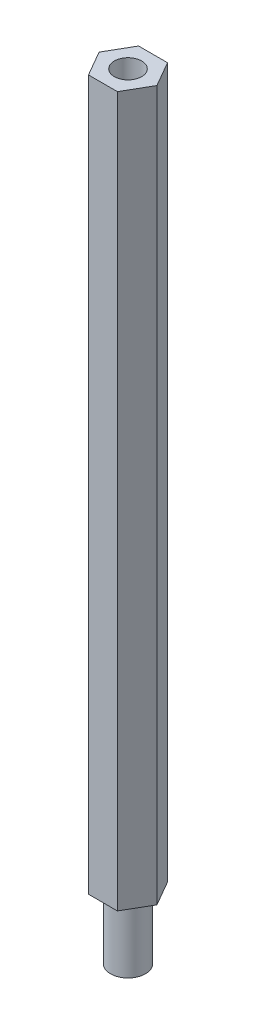
ISO-10303-21;
HEADER;
FILE_DESCRIPTION(('STEP AP214'),'2;1');
FILE_NAME('part.step','',(''),(''),'','','');
FILE_SCHEMA(('AUTOMOTIVE_DESIGN { 1 0 10303 214 1 1 1 1 }'));
ENDSEC;
DATA;
#1=APPLICATION_CONTEXT('core data for automotive mechanical design processes');
#2=APPLICATION_PROTOCOL_DEFINITION('international standard','automotive_design',2000,#1);
#3=PRODUCT_CONTEXT('',#1,'mechanical');
#4=PRODUCT('Part','Part','',(#3));
#5=PRODUCT_RELATED_PRODUCT_CATEGORY('part','',(#4));
#6=PRODUCT_DEFINITION_FORMATION('','',#4);
#7=PRODUCT_DEFINITION_CONTEXT('part definition',#1,'design');
#8=PRODUCT_DEFINITION('design','',#6,#7);
#9=PRODUCT_DEFINITION_SHAPE('','',#8);
#10=(LENGTH_UNIT() NAMED_UNIT(*) SI_UNIT(.MILLI.,.METRE.));
#11=(NAMED_UNIT(*) PLANE_ANGLE_UNIT() SI_UNIT($,.RADIAN.));
#12=(NAMED_UNIT(*) SI_UNIT($,.STERADIAN.) SOLID_ANGLE_UNIT());
#13=UNCERTAINTY_MEASURE_WITH_UNIT(LENGTH_MEASURE(1.E-05),#10,'distance_accuracy_value','');
#14=(GEOMETRIC_REPRESENTATION_CONTEXT(3) GLOBAL_UNCERTAINTY_ASSIGNED_CONTEXT((#13)) GLOBAL_UNIT_ASSIGNED_CONTEXT((#10,
#11,#12)) REPRESENTATION_CONTEXT('',''));
#15=CARTESIAN_POINT('',(0.,0.,0.));
#16=DIRECTION('',(0.,0.,1.));
#17=DIRECTION('',(1.,0.,0.));
#18=AXIS2_PLACEMENT_3D('',#15,#16,#17);
#19=CARTESIAN_POINT('',(-1.325,65.,2.29496732002876));
#20=DIRECTION('',(0.,0.,-1.));
#21=DIRECTION('',(-1.,0.,0.));
#22=AXIS2_PLACEMENT_3D('',#19,#20,#21);
#23=PLANE('',#22);
#24=DIRECTION('',(1.,0.,0.));
#25=VECTOR('',#24,1.);
#26=CARTESIAN_POINT('',(-1.325,0.,2.29496732002876));
#27=LINE('',#26,#25);
#28=CARTESIAN_POINT('',(-1.325,0.,2.29496732002876));
#29=VERTEX_POINT('',#28);
#30=CARTESIAN_POINT('',(1.325,0.,2.29496732002876));
#31=VERTEX_POINT('',#30);
#32=EDGE_CURVE('E121',#29,#31,#27,.T.);
#33=ORIENTED_EDGE('',*,*,#32,.T.);
#34=DIRECTION('',(0.,-1.,0.));
#35=VECTOR('',#34,1.);
#36=CARTESIAN_POINT('',(1.325,65.,2.29496732002876));
#37=LINE('',#36,#35);
#38=CARTESIAN_POINT('',(1.325,65.,2.29496732002876));
#39=VERTEX_POINT('',#38);
#40=EDGE_CURVE('E44',#39,#31,#37,.T.);
#41=ORIENTED_EDGE('',*,*,#40,.F.);
#42=DIRECTION('',(1.,0.,0.));
#43=VECTOR('',#42,1.);
#44=CARTESIAN_POINT('',(-1.325,65.,2.29496732002876));
#45=LINE('',#44,#43);
#46=CARTESIAN_POINT('',(-1.325,65.,2.29496732002876));
#47=VERTEX_POINT('',#46);
#48=EDGE_CURVE('E132',#47,#39,#45,.T.);
#49=ORIENTED_EDGE('',*,*,#48,.F.);
#50=DIRECTION('',(0.,-1.,0.));
#51=VECTOR('',#50,1.);
#52=CARTESIAN_POINT('',(-1.325,65.,2.29496732002876));
#53=LINE('',#52,#51);
#54=EDGE_CURVE('E117',#47,#29,#53,.T.);
#55=ORIENTED_EDGE('',*,*,#54,.T.);
#56=EDGE_LOOP('',(#33,#41,#49,#55));
#57=FACE_BOUND('',#56,.T.);
#58=ADVANCED_FACE('F36',(#57),#23,.F.);
#59=CARTESIAN_POINT('',(1.325,65.,2.29496732002876));
#60=DIRECTION('',(-0.866025403784439,0.,-0.5));
#61=DIRECTION('',(-0.5,0.,0.866025403784439));
#62=AXIS2_PLACEMENT_3D('',#59,#60,#61);
#63=PLANE('',#62);
#64=DIRECTION('',(0.5,0.,-0.866025403784439));
#65=VECTOR('',#64,1.);
#66=CARTESIAN_POINT('',(1.325,0.,2.29496732002876));
#67=LINE('',#66,#65);
#68=CARTESIAN_POINT('',(2.65,0.,0.));
#69=VERTEX_POINT('',#68);
#70=EDGE_CURVE('E124',#31,#69,#67,.T.);
#71=ORIENTED_EDGE('',*,*,#70,.T.);
#72=DIRECTION('',(0.,-1.,0.));
#73=VECTOR('',#72,1.);
#74=CARTESIAN_POINT('',(2.65,65.,0.));
#75=LINE('',#74,#73);
#76=CARTESIAN_POINT('',(2.65,65.,0.));
#77=VERTEX_POINT('',#76);
#78=EDGE_CURVE('E136',#77,#69,#75,.T.);
#79=ORIENTED_EDGE('',*,*,#78,.F.);
#80=DIRECTION('',(0.5,0.,-0.866025403784439));
#81=VECTOR('',#80,1.);
#82=CARTESIAN_POINT('',(1.325,65.,2.29496732002876));
#83=LINE('',#82,#81);
#84=EDGE_CURVE('E90',#39,#77,#83,.T.);
#85=ORIENTED_EDGE('',*,*,#84,.F.);
#86=ORIENTED_EDGE('',*,*,#40,.T.);
#87=EDGE_LOOP('',(#71,#79,#85,#86));
#88=FACE_BOUND('',#87,.T.);
#89=ADVANCED_FACE('F139',(#88),#63,.F.);
#90=CARTESIAN_POINT('',(2.65,65.,0.));
#91=DIRECTION('',(-0.866025403784438,0.,0.5));
#92=DIRECTION('',(0.5,0.,0.866025403784439));
#93=AXIS2_PLACEMENT_3D('',#90,#91,#92);
#94=PLANE('',#93);
#95=DIRECTION('',(-0.5,0.,-0.866025403784439));
#96=VECTOR('',#95,1.);
#97=CARTESIAN_POINT('',(2.65,0.,0.));
#98=LINE('',#97,#96);
#99=CARTESIAN_POINT('',(1.325,0.,-2.29496732002876));
#100=VERTEX_POINT('',#99);
#101=EDGE_CURVE('E127',#69,#100,#98,.T.);
#102=ORIENTED_EDGE('',*,*,#101,.T.);
#103=DIRECTION('',(0.,-1.,0.));
#104=VECTOR('',#103,1.);
#105=CARTESIAN_POINT('',(1.325,65.,-2.29496732002876));
#106=LINE('',#105,#104);
#107=CARTESIAN_POINT('',(1.325,65.,-2.29496732002876));
#108=VERTEX_POINT('',#107);
#109=EDGE_CURVE('E112',#108,#100,#106,.T.);
#110=ORIENTED_EDGE('',*,*,#109,.F.);
#111=DIRECTION('',(-0.5,0.,-0.866025403784439));
#112=VECTOR('',#111,1.);
#113=CARTESIAN_POINT('',(2.65,65.,0.));
#114=LINE('',#113,#112);
#115=EDGE_CURVE('E103',#77,#108,#114,.T.);
#116=ORIENTED_EDGE('',*,*,#115,.F.);
#117=ORIENTED_EDGE('',*,*,#78,.T.);
#118=EDGE_LOOP('',(#102,#110,#116,#117));
#119=FACE_BOUND('',#118,.T.);
#120=ADVANCED_FACE('F147',(#119),#94,.F.);
#121=CARTESIAN_POINT('',(1.325,65.,-2.29496732002876));
#122=DIRECTION('',(0.,0.,1.));
#123=DIRECTION('',(1.,0.,0.));
#124=AXIS2_PLACEMENT_3D('',#121,#122,#123);
#125=PLANE('',#124);
#126=DIRECTION('',(-1.,0.,0.));
#127=VECTOR('',#126,1.);
#128=CARTESIAN_POINT('',(1.325,0.,-2.29496732002876));
#129=LINE('',#128,#127);
#130=CARTESIAN_POINT('',(-1.325,0.,-2.29496732002876));
#131=VERTEX_POINT('',#130);
#132=EDGE_CURVE('E111',#100,#131,#129,.T.);
#133=ORIENTED_EDGE('',*,*,#132,.T.);
#134=DIRECTION('',(0.,-1.,0.));
#135=VECTOR('',#134,1.);
#136=CARTESIAN_POINT('',(-1.325,65.,-2.29496732002876));
#137=LINE('',#136,#135);
#138=CARTESIAN_POINT('',(-1.325,65.,-2.29496732002876));
#139=VERTEX_POINT('',#138);
#140=EDGE_CURVE('E108',#139,#131,#137,.T.);
#141=ORIENTED_EDGE('',*,*,#140,.F.);
#142=DIRECTION('',(-1.,0.,0.));
#143=VECTOR('',#142,1.);
#144=CARTESIAN_POINT('',(1.325,65.,-2.29496732002876));
#145=LINE('',#144,#143);
#146=EDGE_CURVE('E97',#108,#139,#145,.T.);
#147=ORIENTED_EDGE('',*,*,#146,.F.);
#148=ORIENTED_EDGE('',*,*,#109,.T.);
#149=EDGE_LOOP('',(#133,#141,#147,#148));
#150=FACE_BOUND('',#149,.T.);
#151=ADVANCED_FACE('F109',(#150),#125,.F.);
#152=CARTESIAN_POINT('',(-1.325,65.,-2.29496732002876));
#153=DIRECTION('',(0.866025403784439,0.,0.5));
#154=DIRECTION('',(0.5,0.,-0.866025403784439));
#155=AXIS2_PLACEMENT_3D('',#152,#153,#154);
#156=PLANE('',#155);
#157=DIRECTION('',(-0.5,0.,0.866025403784439));
#158=VECTOR('',#157,1.);
#159=CARTESIAN_POINT('',(-1.325,0.,-2.29496732002876));
#160=LINE('',#159,#158);
#161=CARTESIAN_POINT('',(-2.65,0.,0.));
#162=VERTEX_POINT('',#161);
#163=EDGE_CURVE('E75',#131,#162,#160,.T.);
#164=ORIENTED_EDGE('',*,*,#163,.T.);
#165=DIRECTION('',(0.,-1.,0.));
#166=VECTOR('',#165,1.);
#167=CARTESIAN_POINT('',(-2.65,65.,0.));
#168=LINE('',#167,#166);
#169=CARTESIAN_POINT('',(-2.65,65.,0.));
#170=VERTEX_POINT('',#169);
#171=EDGE_CURVE('E113',#170,#162,#168,.T.);
#172=ORIENTED_EDGE('',*,*,#171,.F.);
#173=DIRECTION('',(-0.5,0.,0.866025403784439));
#174=VECTOR('',#173,1.);
#175=CARTESIAN_POINT('',(-1.325,65.,-2.29496732002876));
#176=LINE('',#175,#174);
#177=EDGE_CURVE('E101',#139,#170,#176,.T.);
#178=ORIENTED_EDGE('',*,*,#177,.F.);
#179=ORIENTED_EDGE('',*,*,#140,.T.);
#180=EDGE_LOOP('',(#164,#172,#178,#179));
#181=FACE_BOUND('',#180,.T.);
#182=ADVANCED_FACE('F115',(#181),#156,.F.);
#183=CARTESIAN_POINT('',(-2.65,65.,0.));
#184=DIRECTION('',(0.866025403784438,0.,-0.5));
#185=DIRECTION('',(-0.5,0.,-0.866025403784439));
#186=AXIS2_PLACEMENT_3D('',#183,#184,#185);
#187=PLANE('',#186);
#188=DIRECTION('',(0.5,0.,0.866025403784439));
#189=VECTOR('',#188,1.);
#190=CARTESIAN_POINT('',(-2.65,0.,0.));
#191=LINE('',#190,#189);
#192=EDGE_CURVE('E81',#162,#29,#191,.T.);
#193=ORIENTED_EDGE('',*,*,#192,.T.);
#194=ORIENTED_EDGE('',*,*,#54,.F.);
#195=DIRECTION('',(0.5,0.,0.866025403784439));
#196=VECTOR('',#195,1.);
#197=CARTESIAN_POINT('',(-2.65,65.,0.));
#198=LINE('',#197,#196);
#199=EDGE_CURVE('E52',#170,#47,#198,.T.);
#200=ORIENTED_EDGE('',*,*,#199,.F.);
#201=ORIENTED_EDGE('',*,*,#171,.T.);
#202=EDGE_LOOP('',(#193,#194,#200,#201));
#203=FACE_BOUND('',#202,.T.);
#204=ADVANCED_FACE('F170',(#203),#187,.F.);
#205=CARTESIAN_POINT('',(0.,65.,0.));
#206=DIRECTION('',(0.,1.,0.));
#207=DIRECTION('',(0.,0.,1.));
#208=AXIS2_PLACEMENT_3D('',#205,#206,#207);
#209=PLANE('',#208);
#210=CARTESIAN_POINT('',(0.,65.,0.));
#211=DIRECTION('',(0.,1.,0.));
#212=DIRECTION('',(0.,0.,1.));
#213=AXIS2_PLACEMENT_3D('',#210,#211,#212);
#214=CIRCLE('',#213,1.25);
#215=CARTESIAN_POINT('',(0.,65.,1.25));
#216=VERTEX_POINT('',#215);
#217=EDGE_CURVE('E154',#216,#216,#214,.T.);
#218=ORIENTED_EDGE('',*,*,#217,.F.);
#219=EDGE_LOOP('',(#218));
#220=FACE_BOUND('',#219,.T.);
#221=ORIENTED_EDGE('',*,*,#48,.T.);
#222=ORIENTED_EDGE('',*,*,#84,.T.);
#223=ORIENTED_EDGE('',*,*,#115,.T.);
#224=ORIENTED_EDGE('',*,*,#146,.T.);
#225=ORIENTED_EDGE('',*,*,#177,.T.);
#226=ORIENTED_EDGE('',*,*,#199,.T.);
#227=EDGE_LOOP('',(#221,#222,#223,#224,#225,#226));
#228=FACE_BOUND('',#227,.T.);
#229=ADVANCED_FACE('F99',(#220,#228),#209,.T.);
#230=CARTESIAN_POINT('',(0.,0.,0.));
#231=DIRECTION('',(0.,1.,0.));
#232=DIRECTION('',(0.,0.,1.));
#233=AXIS2_PLACEMENT_3D('',#230,#231,#232);
#234=PLANE('',#233);
#235=CARTESIAN_POINT('',(0.,0.,0.));
#236=DIRECTION('',(0.,1.,0.));
#237=DIRECTION('',(0.,0.,1.));
#238=AXIS2_PLACEMENT_3D('',#235,#236,#237);
#239=CIRCLE('',#238,1.6);
#240=CARTESIAN_POINT('',(0.,0.,1.6));
#241=VERTEX_POINT('',#240);
#242=EDGE_CURVE('E11',#241,#241,#239,.F.);
#243=ORIENTED_EDGE('',*,*,#242,.F.);
#244=EDGE_LOOP('',(#243));
#245=FACE_BOUND('',#244,.T.);
#246=ORIENTED_EDGE('',*,*,#32,.F.);
#247=ORIENTED_EDGE('',*,*,#192,.F.);
#248=ORIENTED_EDGE('',*,*,#163,.F.);
#249=ORIENTED_EDGE('',*,*,#132,.F.);
#250=ORIENTED_EDGE('',*,*,#101,.F.);
#251=ORIENTED_EDGE('',*,*,#70,.F.);
#252=EDGE_LOOP('',(#246,#247,#248,#249,#250,#251));
#253=FACE_BOUND('',#252,.T.);
#254=ADVANCED_FACE('F144',(#245,#253),#234,.F.);
#255=CARTESIAN_POINT('',(0.,-6.,0.));
#256=DIRECTION('',(0.,1.,0.));
#257=DIRECTION('',(0.,0.,1.));
#258=AXIS2_PLACEMENT_3D('',#255,#256,#257);
#259=CYLINDRICAL_SURFACE('',#258,1.6);
#260=CARTESIAN_POINT('',(0.,-6.,0.));
#261=DIRECTION('',(0.,-1.,0.));
#262=DIRECTION('',(0.,0.,-1.));
#263=AXIS2_PLACEMENT_3D('',#260,#261,#262);
#264=CIRCLE('',#263,1.6);
#265=CARTESIAN_POINT('',(0.,-6.,-1.6));
#266=VERTEX_POINT('',#265);
#267=EDGE_CURVE('E125',#266,#266,#264,.T.);
#268=ORIENTED_EDGE('',*,*,#267,.F.);
#269=EDGE_LOOP('',(#268));
#270=FACE_BOUND('',#269,.T.);
#271=ORIENTED_EDGE('',*,*,#242,.T.);
#272=EDGE_LOOP('',(#271));
#273=FACE_BOUND('',#272,.T.);
#274=ADVANCED_FACE('F176',(#270,#273),#259,.T.);
#275=CARTESIAN_POINT('',(0.,-6.,0.));
#276=DIRECTION('',(0.,-1.,0.));
#277=DIRECTION('',(0.,0.,-1.));
#278=AXIS2_PLACEMENT_3D('',#275,#276,#277);
#279=PLANE('',#278);
#280=ORIENTED_EDGE('',*,*,#267,.T.);
#281=EDGE_LOOP('',(#280));
#282=FACE_BOUND('',#281,.T.);
#283=ADVANCED_FACE('F165',(#282),#279,.T.);
#284=CARTESIAN_POINT('',(0.,60.,0.));
#285=DIRECTION('',(0.,1.,0.));
#286=DIRECTION('',(0.,0.,1.));
#287=AXIS2_PLACEMENT_3D('',#284,#285,#286);
#288=CYLINDRICAL_SURFACE('',#287,1.25);
#289=CARTESIAN_POINT('',(0.,60.,0.));
#290=DIRECTION('',(0.,1.,0.));
#291=DIRECTION('',(0.,0.,1.));
#292=AXIS2_PLACEMENT_3D('',#289,#290,#291);
#293=CIRCLE('',#292,1.25);
#294=CARTESIAN_POINT('',(0.,60.,1.25));
#295=VERTEX_POINT('',#294);
#296=EDGE_CURVE('E153',#295,#295,#293,.T.);
#297=ORIENTED_EDGE('',*,*,#296,.F.);
#298=EDGE_LOOP('',(#297));
#299=FACE_BOUND('',#298,.T.);
#300=ORIENTED_EDGE('',*,*,#217,.T.);
#301=EDGE_LOOP('',(#300));
#302=FACE_BOUND('',#301,.T.);
#303=ADVANCED_FACE('F162',(#299,#302),#288,.F.);
#304=CARTESIAN_POINT('',(0.,60.,0.));
#305=DIRECTION('',(0.,1.,0.));
#306=DIRECTION('',(0.,0.,1.));
#307=AXIS2_PLACEMENT_3D('',#304,#305,#306);
#308=PLANE('',#307);
#309=ORIENTED_EDGE('',*,*,#296,.T.);
#310=EDGE_LOOP('',(#309));
#311=FACE_BOUND('',#310,.T.);
#312=ADVANCED_FACE('F160',(#311),#308,.T.);
#313=CLOSED_SHELL('',(#58,#89,#120,#151,#182,#204,#229,#254,#274,#283,#303,#312));
#314=MANIFOLD_SOLID_BREP('B2',#313);
#315=ADVANCED_BREP_SHAPE_REPRESENTATION('',(#18,#314),#14);
#316=SHAPE_DEFINITION_REPRESENTATION(#9,#315);
ENDSEC;
END-ISO-10303-21;
